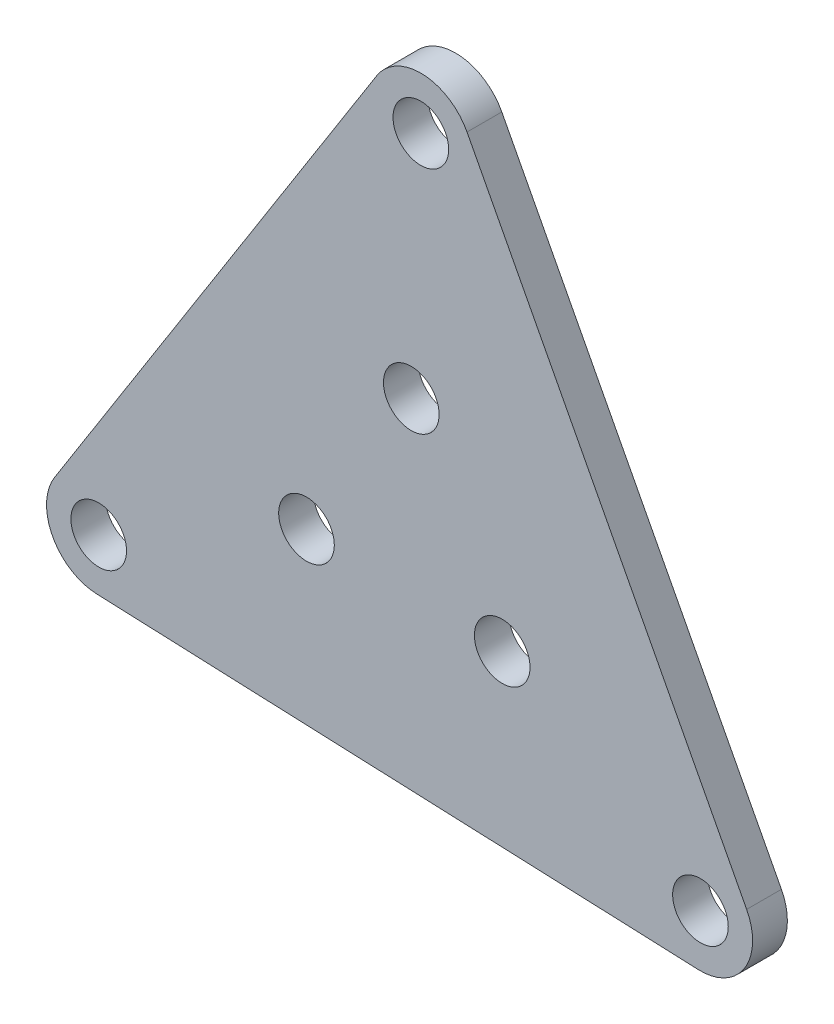
ISO-10303-21;
HEADER;
FILE_DESCRIPTION(('STEP AP214'),'2;1');
FILE_NAME('part.step','',(''),(''),'','','');
FILE_SCHEMA(('AUTOMOTIVE_DESIGN { 1 0 10303 214 1 1 1 1 }'));
ENDSEC;
DATA;
#1=APPLICATION_CONTEXT('core data for automotive mechanical design processes');
#2=APPLICATION_PROTOCOL_DEFINITION('international standard','automotive_design',2000,#1);
#3=PRODUCT_CONTEXT('',#1,'mechanical');
#4=PRODUCT('Part','Part','',(#3));
#5=PRODUCT_RELATED_PRODUCT_CATEGORY('part','',(#4));
#6=PRODUCT_DEFINITION_FORMATION('','',#4);
#7=PRODUCT_DEFINITION_CONTEXT('part definition',#1,'design');
#8=PRODUCT_DEFINITION('design','',#6,#7);
#9=PRODUCT_DEFINITION_SHAPE('','',#8);
#10=(LENGTH_UNIT() NAMED_UNIT(*) SI_UNIT(.MILLI.,.METRE.));
#11=(NAMED_UNIT(*) PLANE_ANGLE_UNIT() SI_UNIT($,.RADIAN.));
#12=(NAMED_UNIT(*) SI_UNIT($,.STERADIAN.) SOLID_ANGLE_UNIT());
#13=UNCERTAINTY_MEASURE_WITH_UNIT(LENGTH_MEASURE(1.E-05),#10,'distance_accuracy_value','');
#14=(GEOMETRIC_REPRESENTATION_CONTEXT(3) GLOBAL_UNCERTAINTY_ASSIGNED_CONTEXT((#13)) GLOBAL_UNIT_ASSIGNED_CONTEXT((#10,
#11,#12)) REPRESENTATION_CONTEXT('',''));
#15=CARTESIAN_POINT('',(0.,0.,0.));
#16=DIRECTION('',(0.,0.,1.));
#17=DIRECTION('',(1.,0.,0.));
#18=AXIS2_PLACEMENT_3D('',#15,#16,#17);
#19=CARTESIAN_POINT('',(-17.7135791475737,-9.28596326627909,2.));
#20=DIRECTION('',(0.,0.,1.));
#21=DIRECTION('',(1.,0.,0.));
#22=AXIS2_PLACEMENT_3D('',#19,#20,#21);
#23=PLANE('',#22);
#24=CARTESIAN_POINT('',(-5.76169797696947,-3.02044636602206,2.));
#25=DIRECTION('',(0.,0.,1.));
#26=DIRECTION('',(1.,0.,0.));
#27=AXIS2_PLACEMENT_3D('',#24,#25,#26);
#28=CIRCLE('',#27,1.6);
#29=CARTESIAN_POINT('',(-4.16169797696947,-3.02044636602206,2.));
#30=VERTEX_POINT('',#29);
#31=EDGE_CURVE('E196',#30,#30,#28,.T.);
#32=ORIENTED_EDGE('',*,*,#31,.F.);
#33=EDGE_LOOP('',(#32));
#34=FACE_BOUND('',#33,.T.);
#35=CARTESIAN_POINT('',(0.814909486579385,19.9833911668836,2.));
#36=DIRECTION('',(0.,0.,1.));
#37=DIRECTION('',(1.,0.,0.));
#38=AXIS2_PLACEMENT_3D('',#35,#36,#37);
#39=CIRCLE('',#38,1.6);
#40=CARTESIAN_POINT('',(2.41490948657939,19.9833911668836,2.));
#41=VERTEX_POINT('',#40);
#42=EDGE_CURVE('E208',#41,#41,#39,.T.);
#43=ORIENTED_EDGE('',*,*,#42,.F.);
#44=EDGE_LOOP('',(#43));
#45=FACE_BOUND('',#44,.T.);
#46=CARTESIAN_POINT('',(16.8986696609943,-10.6974279006045,2.));
#47=DIRECTION('',(0.,0.,1.));
#48=DIRECTION('',(1.,0.,0.));
#49=AXIS2_PLACEMENT_3D('',#46,#47,#48);
#50=CIRCLE('',#49,1.6);
#51=CARTESIAN_POINT('',(18.4986696609943,-10.6974279006045,2.));
#52=VERTEX_POINT('',#51);
#53=EDGE_CURVE('E121',#52,#52,#50,.T.);
#54=ORIENTED_EDGE('',*,*,#53,.F.);
#55=EDGE_LOOP('',(#54));
#56=FACE_BOUND('',#55,.T.);
#57=CARTESIAN_POINT('',(-17.7135791475737,-9.28596326627909,2.));
#58=DIRECTION('',(0.,0.,1.));
#59=DIRECTION('',(1.,0.,0.));
#60=AXIS2_PLACEMENT_3D('',#57,#58,#59);
#61=CIRCLE('',#60,3.);
#62=CARTESIAN_POINT('',(-20.2483795967226,-7.68134908118834,2.));
#63=VERTEX_POINT('',#62);
#64=CARTESIAN_POINT('',(-17.8358155705606,-12.2834719413116,2.));
#65=VERTEX_POINT('',#64);
#66=EDGE_CURVE('E128',#63,#65,#61,.T.);
#67=ORIENTED_EDGE('',*,*,#66,.T.);
#68=DIRECTION('',(0.999169558344182,-0.0407454743289689,0.));
#69=VECTOR('',#68,1.);
#70=CARTESIAN_POINT('',(-17.8358155705606,-12.2834719413116,2.));
#71=LINE('',#70,#69);
#72=CARTESIAN_POINT('',(16.7764332380074,-13.6949365756371,2.));
#73=VERTEX_POINT('',#72);
#74=EDGE_CURVE('E86',#65,#73,#71,.T.);
#75=ORIENTED_EDGE('',*,*,#74,.T.);
#76=CARTESIAN_POINT('',(16.8986696609943,-10.6974279006045,2.));
#77=DIRECTION('',(0.,0.,1.));
#78=DIRECTION('',(1.,0.,0.));
#79=AXIS2_PLACEMENT_3D('',#76,#77,#78);
#80=CIRCLE('',#79,3.);
#81=CARTESIAN_POINT('',(19.5557065331301,-9.30453341066259,2.));
#82=VERTEX_POINT('',#81);
#83=EDGE_CURVE('E99',#73,#82,#80,.T.);
#84=ORIENTED_EDGE('',*,*,#83,.T.);
#85=DIRECTION('',(-0.464298163313983,0.88567895737861,0.));
#86=VECTOR('',#85,1.);
#87=CARTESIAN_POINT('',(19.5557065331301,-9.30453341066259,2.));
#88=LINE('',#87,#86);
#89=CARTESIAN_POINT('',(3.47194635871521,21.3762856568256,2.));
#90=VERTEX_POINT('',#89);
#91=EDGE_CURVE('E93',#82,#90,#88,.T.);
#92=ORIENTED_EDGE('',*,*,#91,.T.);
#93=CARTESIAN_POINT('',(0.814909486579385,19.9833911668836,2.));
#94=DIRECTION('',(0.,0.,1.));
#95=DIRECTION('',(1.,0.,0.));
#96=AXIS2_PLACEMENT_3D('',#93,#94,#95);
#97=CIRCLE('',#96,3.);
#98=CARTESIAN_POINT('',(-1.71989096256953,21.5880053519744,2.));
#99=VERTEX_POINT('',#98);
#100=EDGE_CURVE('E97',#90,#99,#97,.T.);
#101=ORIENTED_EDGE('',*,*,#100,.T.);
#102=DIRECTION('',(-0.534871395030251,-0.844933483049638,0.));
#103=VECTOR('',#102,1.);
#104=CARTESIAN_POINT('',(-1.71989096256953,21.5880053519744,2.));
#105=LINE('',#104,#103);
#106=EDGE_CURVE('E49',#99,#63,#105,.T.);
#107=ORIENTED_EDGE('',*,*,#106,.T.);
#108=EDGE_LOOP('',(#67,#75,#84,#92,#101,#107));
#109=FACE_BOUND('',#108,.T.);
#110=CARTESIAN_POINT('',(-17.7135791475737,-9.28596326627909,2.));
#111=DIRECTION('',(0.,0.,1.));
#112=DIRECTION('',(1.,0.,0.));
#113=AXIS2_PLACEMENT_3D('',#110,#111,#112);
#114=CIRCLE('',#113,1.6);
#115=CARTESIAN_POINT('',(-16.1135791475737,-9.28596326627909,2.));
#116=VERTEX_POINT('',#115);
#117=EDGE_CURVE('E214',#116,#116,#114,.T.);
#118=ORIENTED_EDGE('',*,*,#117,.F.);
#119=EDGE_LOOP('',(#118));
#120=FACE_BOUND('',#119,.T.);
#121=CARTESIAN_POINT('',(0.265065704741243,6.5,2.));
#122=DIRECTION('',(0.,0.,1.));
#123=DIRECTION('',(1.,0.,0.));
#124=AXIS2_PLACEMENT_3D('',#121,#122,#123);
#125=CIRCLE('',#124,1.6);
#126=CARTESIAN_POINT('',(1.86506570474124,6.5,2.));
#127=VERTEX_POINT('',#126);
#128=EDGE_CURVE('E202',#127,#127,#125,.T.);
#129=ORIENTED_EDGE('',*,*,#128,.F.);
#130=EDGE_LOOP('',(#129));
#131=FACE_BOUND('',#130,.T.);
#132=CARTESIAN_POINT('',(5.49663227222823,-3.47955363397794,2.));
#133=DIRECTION('',(0.,0.,1.));
#134=DIRECTION('',(1.,0.,0.));
#135=AXIS2_PLACEMENT_3D('',#132,#133,#134);
#136=CIRCLE('',#135,1.6);
#137=CARTESIAN_POINT('',(7.09663227222823,-3.47955363397794,2.));
#138=VERTEX_POINT('',#137);
#139=EDGE_CURVE('E187',#138,#138,#136,.T.);
#140=ORIENTED_EDGE('',*,*,#139,.F.);
#141=EDGE_LOOP('',(#140));
#142=FACE_BOUND('',#141,.T.);
#143=ADVANCED_FACE('F32',(#34,#45,#56,#109,#120,#131,#142),#23,.T.);
#144=CARTESIAN_POINT('',(-17.7135791475737,-9.28596326627909,0.));
#145=DIRECTION('',(0.,0.,1.));
#146=DIRECTION('',(1.,0.,0.));
#147=AXIS2_PLACEMENT_3D('',#144,#145,#146);
#148=PLANE('',#147);
#149=CARTESIAN_POINT('',(-17.7135791475737,-9.28596326627909,0.));
#150=DIRECTION('',(0.,0.,1.));
#151=DIRECTION('',(1.,0.,0.));
#152=AXIS2_PLACEMENT_3D('',#149,#150,#151);
#153=CIRCLE('',#152,3.);
#154=CARTESIAN_POINT('',(-20.2483795967226,-7.68134908118834,0.));
#155=VERTEX_POINT('',#154);
#156=CARTESIAN_POINT('',(-17.8358155705606,-12.2834719413116,0.));
#157=VERTEX_POINT('',#156);
#158=EDGE_CURVE('E117',#155,#157,#153,.T.);
#159=ORIENTED_EDGE('',*,*,#158,.F.);
#160=DIRECTION('',(-0.534871395030251,-0.844933483049638,0.));
#161=VECTOR('',#160,1.);
#162=CARTESIAN_POINT('',(-1.71989096256953,21.5880053519744,0.));
#163=LINE('',#162,#161);
#164=CARTESIAN_POINT('',(-1.71989096256953,21.5880053519744,0.));
#165=VERTEX_POINT('',#164);
#166=EDGE_CURVE('E78',#165,#155,#163,.T.);
#167=ORIENTED_EDGE('',*,*,#166,.F.);
#168=CARTESIAN_POINT('',(0.814909486579385,19.9833911668836,0.));
#169=DIRECTION('',(0.,0.,1.));
#170=DIRECTION('',(1.,0.,0.));
#171=AXIS2_PLACEMENT_3D('',#168,#169,#170);
#172=CIRCLE('',#171,3.);
#173=CARTESIAN_POINT('',(3.47194635871521,21.3762856568256,0.));
#174=VERTEX_POINT('',#173);
#175=EDGE_CURVE('E72',#174,#165,#172,.T.);
#176=ORIENTED_EDGE('',*,*,#175,.F.);
#177=DIRECTION('',(-0.464298163313983,0.88567895737861,0.));
#178=VECTOR('',#177,1.);
#179=CARTESIAN_POINT('',(19.5557065331301,-9.30453341066259,0.));
#180=LINE('',#179,#178);
#181=CARTESIAN_POINT('',(19.5557065331301,-9.30453341066259,0.));
#182=VERTEX_POINT('',#181);
#183=EDGE_CURVE('E107',#182,#174,#180,.T.);
#184=ORIENTED_EDGE('',*,*,#183,.F.);
#185=CARTESIAN_POINT('',(16.8986696609943,-10.6974279006045,0.));
#186=DIRECTION('',(0.,0.,1.));
#187=DIRECTION('',(1.,0.,0.));
#188=AXIS2_PLACEMENT_3D('',#185,#186,#187);
#189=CIRCLE('',#188,3.);
#190=CARTESIAN_POINT('',(16.7764332380074,-13.6949365756371,0.));
#191=VERTEX_POINT('',#190);
#192=EDGE_CURVE('E123',#191,#182,#189,.T.);
#193=ORIENTED_EDGE('',*,*,#192,.F.);
#194=DIRECTION('',(0.999169558344182,-0.0407454743289689,0.));
#195=VECTOR('',#194,1.);
#196=CARTESIAN_POINT('',(-17.8358155705606,-12.2834719413116,0.));
#197=LINE('',#196,#195);
#198=EDGE_CURVE('E120',#157,#191,#197,.T.);
#199=ORIENTED_EDGE('',*,*,#198,.F.);
#200=EDGE_LOOP('',(#159,#167,#176,#184,#193,#199));
#201=FACE_BOUND('',#200,.T.);
#202=CARTESIAN_POINT('',(16.8986696609943,-10.6974279006045,0.));
#203=DIRECTION('',(0.,0.,1.));
#204=DIRECTION('',(1.,0.,0.));
#205=AXIS2_PLACEMENT_3D('',#202,#203,#204);
#206=CIRCLE('',#205,1.6);
#207=CARTESIAN_POINT('',(18.4986696609943,-10.6974279006045,0.));
#208=VERTEX_POINT('',#207);
#209=EDGE_CURVE('E217',#208,#208,#206,.T.);
#210=ORIENTED_EDGE('',*,*,#209,.T.);
#211=EDGE_LOOP('',(#210));
#212=FACE_BOUND('',#211,.T.);
#213=CARTESIAN_POINT('',(-17.7135791475737,-9.28596326627909,0.));
#214=DIRECTION('',(0.,0.,1.));
#215=DIRECTION('',(1.,0.,0.));
#216=AXIS2_PLACEMENT_3D('',#213,#214,#215);
#217=CIRCLE('',#216,1.6);
#218=CARTESIAN_POINT('',(-16.1135791475737,-9.28596326627909,0.));
#219=VERTEX_POINT('',#218);
#220=EDGE_CURVE('E211',#219,#219,#217,.T.);
#221=ORIENTED_EDGE('',*,*,#220,.T.);
#222=EDGE_LOOP('',(#221));
#223=FACE_BOUND('',#222,.T.);
#224=CARTESIAN_POINT('',(0.814909486579385,19.9833911668836,0.));
#225=DIRECTION('',(0.,0.,1.));
#226=DIRECTION('',(1.,0.,0.));
#227=AXIS2_PLACEMENT_3D('',#224,#225,#226);
#228=CIRCLE('',#227,1.6);
#229=CARTESIAN_POINT('',(2.41490948657939,19.9833911668836,0.));
#230=VERTEX_POINT('',#229);
#231=EDGE_CURVE('E205',#230,#230,#228,.T.);
#232=ORIENTED_EDGE('',*,*,#231,.T.);
#233=EDGE_LOOP('',(#232));
#234=FACE_BOUND('',#233,.T.);
#235=CARTESIAN_POINT('',(0.265065704741243,6.5,0.));
#236=DIRECTION('',(0.,0.,1.));
#237=DIRECTION('',(1.,0.,0.));
#238=AXIS2_PLACEMENT_3D('',#235,#236,#237);
#239=CIRCLE('',#238,1.6);
#240=CARTESIAN_POINT('',(1.86506570474124,6.5,0.));
#241=VERTEX_POINT('',#240);
#242=EDGE_CURVE('E199',#241,#241,#239,.T.);
#243=ORIENTED_EDGE('',*,*,#242,.T.);
#244=EDGE_LOOP('',(#243));
#245=FACE_BOUND('',#244,.T.);
#246=CARTESIAN_POINT('',(-5.76169797696947,-3.02044636602206,0.));
#247=DIRECTION('',(0.,0.,1.));
#248=DIRECTION('',(1.,0.,0.));
#249=AXIS2_PLACEMENT_3D('',#246,#247,#248);
#250=CIRCLE('',#249,1.6);
#251=CARTESIAN_POINT('',(-4.16169797696947,-3.02044636602206,0.));
#252=VERTEX_POINT('',#251);
#253=EDGE_CURVE('E193',#252,#252,#250,.T.);
#254=ORIENTED_EDGE('',*,*,#253,.T.);
#255=EDGE_LOOP('',(#254));
#256=FACE_BOUND('',#255,.T.);
#257=CARTESIAN_POINT('',(5.49663227222823,-3.47955363397794,0.));
#258=DIRECTION('',(0.,0.,1.));
#259=DIRECTION('',(1.,0.,0.));
#260=AXIS2_PLACEMENT_3D('',#257,#258,#259);
#261=CIRCLE('',#260,1.6);
#262=CARTESIAN_POINT('',(7.09663227222823,-3.47955363397794,0.));
#263=VERTEX_POINT('',#262);
#264=EDGE_CURVE('E190',#263,#263,#261,.T.);
#265=ORIENTED_EDGE('',*,*,#264,.T.);
#266=EDGE_LOOP('',(#265));
#267=FACE_BOUND('',#266,.T.);
#268=ADVANCED_FACE('F137',(#201,#212,#223,#234,#245,#256,#267),#148,.F.);
#269=CARTESIAN_POINT('',(-17.7135791475737,-9.28596326627909,2.));
#270=DIRECTION('',(0.,0.,-1.));
#271=DIRECTION('',(-1.,0.,0.));
#272=AXIS2_PLACEMENT_3D('',#269,#270,#271);
#273=CYLINDRICAL_SURFACE('',#272,3.);
#274=ORIENTED_EDGE('',*,*,#158,.T.);
#275=DIRECTION('',(0.,0.,-1.));
#276=VECTOR('',#275,1.);
#277=CARTESIAN_POINT('',(-17.8358155705606,-12.2834719413116,2.));
#278=LINE('',#277,#276);
#279=EDGE_CURVE('E11',#65,#157,#278,.T.);
#280=ORIENTED_EDGE('',*,*,#279,.F.);
#281=ORIENTED_EDGE('',*,*,#66,.F.);
#282=DIRECTION('',(0.,0.,-1.));
#283=VECTOR('',#282,1.);
#284=CARTESIAN_POINT('',(-20.2483795967226,-7.68134908118834,2.));
#285=LINE('',#284,#283);
#286=EDGE_CURVE('E113',#63,#155,#285,.T.);
#287=ORIENTED_EDGE('',*,*,#286,.T.);
#288=EDGE_LOOP('',(#274,#280,#281,#287));
#289=FACE_BOUND('',#288,.T.);
#290=ADVANCED_FACE('F34',(#289),#273,.T.);
#291=CARTESIAN_POINT('',(-17.8358155705606,-12.2834719413116,2.));
#292=DIRECTION('',(0.0407454743289689,0.999169558344182,0.));
#293=DIRECTION('',(-0.999169558344182,0.0407454743289689,0.));
#294=AXIS2_PLACEMENT_3D('',#291,#292,#293);
#295=PLANE('',#294);
#296=ORIENTED_EDGE('',*,*,#198,.T.);
#297=DIRECTION('',(0.,0.,-1.));
#298=VECTOR('',#297,1.);
#299=CARTESIAN_POINT('',(16.7764332380074,-13.6949365756371,2.));
#300=LINE('',#299,#298);
#301=EDGE_CURVE('E41',#73,#191,#300,.T.);
#302=ORIENTED_EDGE('',*,*,#301,.F.);
#303=ORIENTED_EDGE('',*,*,#74,.F.);
#304=ORIENTED_EDGE('',*,*,#279,.T.);
#305=EDGE_LOOP('',(#296,#302,#303,#304));
#306=FACE_BOUND('',#305,.T.);
#307=ADVANCED_FACE('F293',(#306),#295,.F.);
#308=CARTESIAN_POINT('',(16.8986696609943,-10.6974279006045,2.));
#309=DIRECTION('',(0.,0.,-1.));
#310=DIRECTION('',(-1.,0.,0.));
#311=AXIS2_PLACEMENT_3D('',#308,#309,#310);
#312=CYLINDRICAL_SURFACE('',#311,3.);
#313=ORIENTED_EDGE('',*,*,#192,.T.);
#314=DIRECTION('',(0.,0.,-1.));
#315=VECTOR('',#314,1.);
#316=CARTESIAN_POINT('',(19.5557065331301,-9.30453341066259,2.));
#317=LINE('',#316,#315);
#318=EDGE_CURVE('E108',#82,#182,#317,.T.);
#319=ORIENTED_EDGE('',*,*,#318,.F.);
#320=ORIENTED_EDGE('',*,*,#83,.F.);
#321=ORIENTED_EDGE('',*,*,#301,.T.);
#322=EDGE_LOOP('',(#313,#319,#320,#321));
#323=FACE_BOUND('',#322,.T.);
#324=ADVANCED_FACE('F134',(#323),#312,.T.);
#325=CARTESIAN_POINT('',(19.5557065331301,-9.30453341066259,2.));
#326=DIRECTION('',(-0.88567895737861,-0.464298163313983,0.));
#327=DIRECTION('',(0.464298163313983,-0.88567895737861,0.));
#328=AXIS2_PLACEMENT_3D('',#325,#326,#327);
#329=PLANE('',#328);
#330=ORIENTED_EDGE('',*,*,#183,.T.);
#331=DIRECTION('',(0.,0.,-1.));
#332=VECTOR('',#331,1.);
#333=CARTESIAN_POINT('',(3.47194635871521,21.3762856568256,2.));
#334=LINE('',#333,#332);
#335=EDGE_CURVE('E104',#90,#174,#334,.T.);
#336=ORIENTED_EDGE('',*,*,#335,.F.);
#337=ORIENTED_EDGE('',*,*,#91,.F.);
#338=ORIENTED_EDGE('',*,*,#318,.T.);
#339=EDGE_LOOP('',(#330,#336,#337,#338));
#340=FACE_BOUND('',#339,.T.);
#341=ADVANCED_FACE('F105',(#340),#329,.F.);
#342=CARTESIAN_POINT('',(0.814909486579385,19.9833911668836,2.));
#343=DIRECTION('',(0.,0.,-1.));
#344=DIRECTION('',(-1.,0.,0.));
#345=AXIS2_PLACEMENT_3D('',#342,#343,#344);
#346=CYLINDRICAL_SURFACE('',#345,3.);
#347=ORIENTED_EDGE('',*,*,#175,.T.);
#348=DIRECTION('',(0.,0.,-1.));
#349=VECTOR('',#348,1.);
#350=CARTESIAN_POINT('',(-1.71989096256953,21.5880053519744,2.));
#351=LINE('',#350,#349);
#352=EDGE_CURVE('E109',#99,#165,#351,.T.);
#353=ORIENTED_EDGE('',*,*,#352,.F.);
#354=ORIENTED_EDGE('',*,*,#100,.F.);
#355=ORIENTED_EDGE('',*,*,#335,.T.);
#356=EDGE_LOOP('',(#347,#353,#354,#355));
#357=FACE_BOUND('',#356,.T.);
#358=ADVANCED_FACE('F111',(#357),#346,.T.);
#359=CARTESIAN_POINT('',(-1.71989096256953,21.5880053519744,2.));
#360=DIRECTION('',(0.844933483049638,-0.534871395030251,0.));
#361=DIRECTION('',(0.534871395030251,0.844933483049638,0.));
#362=AXIS2_PLACEMENT_3D('',#359,#360,#361);
#363=PLANE('',#362);
#364=ORIENTED_EDGE('',*,*,#166,.T.);
#365=ORIENTED_EDGE('',*,*,#286,.F.);
#366=ORIENTED_EDGE('',*,*,#106,.F.);
#367=ORIENTED_EDGE('',*,*,#352,.T.);
#368=EDGE_LOOP('',(#364,#365,#366,#367));
#369=FACE_BOUND('',#368,.T.);
#370=ADVANCED_FACE('F142',(#369),#363,.F.);
#371=CARTESIAN_POINT('',(16.8986696609943,-10.6974279006045,2.));
#372=DIRECTION('',(0.,0.,-1.));
#373=DIRECTION('',(-1.,0.,0.));
#374=AXIS2_PLACEMENT_3D('',#371,#372,#373);
#375=CYLINDRICAL_SURFACE('',#374,1.6);
#376=ORIENTED_EDGE('',*,*,#53,.T.);
#377=EDGE_LOOP('',(#376));
#378=FACE_BOUND('',#377,.T.);
#379=ORIENTED_EDGE('',*,*,#209,.F.);
#380=EDGE_LOOP('',(#379));
#381=FACE_BOUND('',#380,.T.);
#382=ADVANCED_FACE('F144',(#378,#381),#375,.F.);
#383=CARTESIAN_POINT('',(-17.7135791475737,-9.28596326627909,2.));
#384=DIRECTION('',(0.,0.,-1.));
#385=DIRECTION('',(-1.,0.,0.));
#386=AXIS2_PLACEMENT_3D('',#383,#384,#385);
#387=CYLINDRICAL_SURFACE('',#386,1.6);
#388=ORIENTED_EDGE('',*,*,#117,.T.);
#389=EDGE_LOOP('',(#388));
#390=FACE_BOUND('',#389,.T.);
#391=ORIENTED_EDGE('',*,*,#220,.F.);
#392=EDGE_LOOP('',(#391));
#393=FACE_BOUND('',#392,.T.);
#394=ADVANCED_FACE('F150',(#390,#393),#387,.F.);
#395=CARTESIAN_POINT('',(0.814909486579385,19.9833911668836,2.));
#396=DIRECTION('',(0.,0.,-1.));
#397=DIRECTION('',(-1.,0.,0.));
#398=AXIS2_PLACEMENT_3D('',#395,#396,#397);
#399=CYLINDRICAL_SURFACE('',#398,1.6);
#400=ORIENTED_EDGE('',*,*,#42,.T.);
#401=EDGE_LOOP('',(#400));
#402=FACE_BOUND('',#401,.T.);
#403=ORIENTED_EDGE('',*,*,#231,.F.);
#404=EDGE_LOOP('',(#403));
#405=FACE_BOUND('',#404,.T.);
#406=ADVANCED_FACE('F166',(#402,#405),#399,.F.);
#407=CARTESIAN_POINT('',(0.265065704741243,6.5,2.));
#408=DIRECTION('',(0.,0.,-1.));
#409=DIRECTION('',(-1.,0.,0.));
#410=AXIS2_PLACEMENT_3D('',#407,#408,#409);
#411=CYLINDRICAL_SURFACE('',#410,1.6);
#412=ORIENTED_EDGE('',*,*,#128,.T.);
#413=EDGE_LOOP('',(#412));
#414=FACE_BOUND('',#413,.T.);
#415=ORIENTED_EDGE('',*,*,#242,.F.);
#416=EDGE_LOOP('',(#415));
#417=FACE_BOUND('',#416,.T.);
#418=ADVANCED_FACE('F170',(#414,#417),#411,.F.);
#419=CARTESIAN_POINT('',(-5.76169797696947,-3.02044636602206,2.));
#420=DIRECTION('',(0.,0.,-1.));
#421=DIRECTION('',(-1.,0.,0.));
#422=AXIS2_PLACEMENT_3D('',#419,#420,#421);
#423=CYLINDRICAL_SURFACE('',#422,1.6);
#424=ORIENTED_EDGE('',*,*,#31,.T.);
#425=EDGE_LOOP('',(#424));
#426=FACE_BOUND('',#425,.T.);
#427=ORIENTED_EDGE('',*,*,#253,.F.);
#428=EDGE_LOOP('',(#427));
#429=FACE_BOUND('',#428,.T.);
#430=ADVANCED_FACE('F174',(#426,#429),#423,.F.);
#431=CARTESIAN_POINT('',(5.49663227222823,-3.47955363397794,2.));
#432=DIRECTION('',(0.,0.,-1.));
#433=DIRECTION('',(-1.,0.,0.));
#434=AXIS2_PLACEMENT_3D('',#431,#432,#433);
#435=CYLINDRICAL_SURFACE('',#434,1.6);
#436=ORIENTED_EDGE('',*,*,#139,.T.);
#437=EDGE_LOOP('',(#436));
#438=FACE_BOUND('',#437,.T.);
#439=ORIENTED_EDGE('',*,*,#264,.F.);
#440=EDGE_LOOP('',(#439));
#441=FACE_BOUND('',#440,.T.);
#442=ADVANCED_FACE('F178',(#438,#441),#435,.F.);
#443=CLOSED_SHELL('',(#143,#268,#290,#307,#324,#341,#358,#370,#382,#394,#406,#418,#430,#442));
#444=MANIFOLD_SOLID_BREP('B2',#443);
#445=ADVANCED_BREP_SHAPE_REPRESENTATION('',(#18,#444),#14);
#446=SHAPE_DEFINITION_REPRESENTATION(#9,#445);
ENDSEC;
END-ISO-10303-21;
